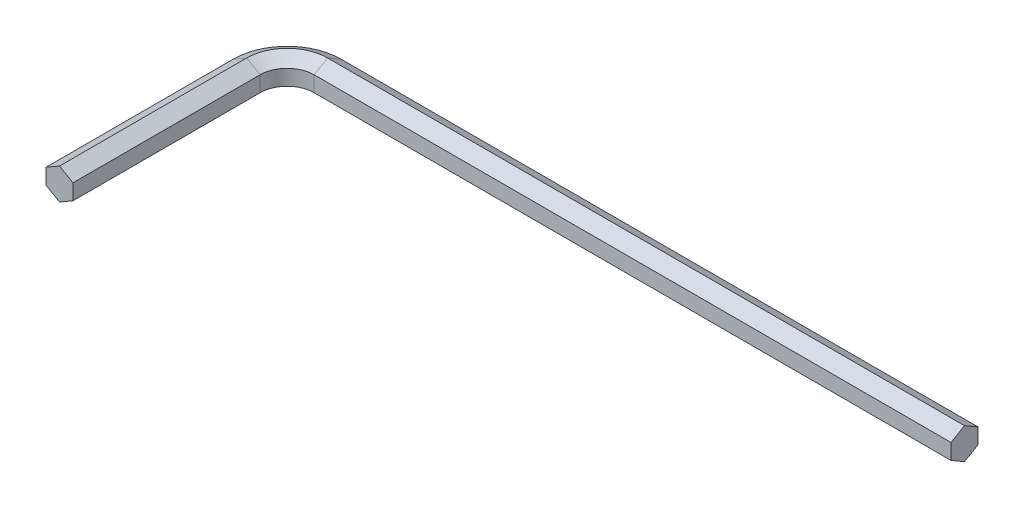
ISO-10303-21;
HEADER;
FILE_DESCRIPTION(('STEP AP214'),'2;1');
FILE_NAME('part.step','',(''),(''),'','','');
FILE_SCHEMA(('AUTOMOTIVE_DESIGN { 1 0 10303 214 1 1 1 1 }'));
ENDSEC;
DATA;
#1=APPLICATION_CONTEXT('core data for automotive mechanical design processes');
#2=APPLICATION_PROTOCOL_DEFINITION('international standard','automotive_design',2000,#1);
#3=PRODUCT_CONTEXT('',#1,'mechanical');
#4=PRODUCT('Part','Part','',(#3));
#5=PRODUCT_RELATED_PRODUCT_CATEGORY('part','',(#4));
#6=PRODUCT_DEFINITION_FORMATION('','',#4);
#7=PRODUCT_DEFINITION_CONTEXT('part definition',#1,'design');
#8=PRODUCT_DEFINITION('design','',#6,#7);
#9=PRODUCT_DEFINITION_SHAPE('','',#8);
#10=(LENGTH_UNIT() NAMED_UNIT(*) SI_UNIT(.MILLI.,.METRE.));
#11=(NAMED_UNIT(*) PLANE_ANGLE_UNIT() SI_UNIT($,.RADIAN.));
#12=(NAMED_UNIT(*) SI_UNIT($,.STERADIAN.) SOLID_ANGLE_UNIT());
#13=UNCERTAINTY_MEASURE_WITH_UNIT(LENGTH_MEASURE(1.E-05),#10,'distance_accuracy_value','');
#14=(GEOMETRIC_REPRESENTATION_CONTEXT(3) GLOBAL_UNCERTAINTY_ASSIGNED_CONTEXT((#13)) GLOBAL_UNIT_ASSIGNED_CONTEXT((#10,
#11,#12)) REPRESENTATION_CONTEXT('',''));
#15=CARTESIAN_POINT('',(0.,0.,0.));
#16=DIRECTION('',(0.,0.,1.));
#17=DIRECTION('',(1.,0.,0.));
#18=AXIS2_PLACEMENT_3D('',#15,#16,#17);
#19=CARTESIAN_POINT('',(-49.2125,1.15470053837925,2.00000000000002));
#20=DIRECTION('',(-1.,0.,0.));
#21=DIRECTION('',(0.,-1.,0.));
#22=AXIS2_PLACEMENT_3D('',#19,#20,#21);
#23=PLANE('',#22);
#24=DIRECTION('',(0.,-1.,0.));
#25=VECTOR('',#24,1.);
#26=CARTESIAN_POINT('',(-49.2125,1.15470053837925,2.00000000000002));
#27=LINE('',#26,#25);
#28=CARTESIAN_POINT('',(-49.2125,1.15470053837925,2.00000000000002));
#29=VERTEX_POINT('',#28);
#30=CARTESIAN_POINT('',(-49.2125,0.,2.00000000000002));
#31=VERTEX_POINT('',#30);
#32=EDGE_CURVE('E135',#29,#31,#27,.T.);
#33=ORIENTED_EDGE('',*,*,#32,.F.);
#34=DIRECTION('',(0.,0.,1.));
#35=VECTOR('',#34,1.);
#36=CARTESIAN_POINT('',(-49.2125,1.15470053837925,2.00000000000002));
#37=LINE('',#36,#35);
#38=CARTESIAN_POINT('',(-49.2125,1.15470053837925,15.875));
#39=VERTEX_POINT('',#38);
#40=EDGE_CURVE('E40',#29,#39,#37,.T.);
#41=ORIENTED_EDGE('',*,*,#40,.T.);
#42=DIRECTION('',(0.,-1.,0.));
#43=VECTOR('',#42,1.);
#44=CARTESIAN_POINT('',(-49.2125,1.15470053837925,15.875));
#45=LINE('',#44,#43);
#46=CARTESIAN_POINT('',(-49.2125,0.,15.875));
#47=VERTEX_POINT('',#46);
#48=EDGE_CURVE('E47',#39,#47,#45,.T.);
#49=ORIENTED_EDGE('',*,*,#48,.T.);
#50=DIRECTION('',(0.,0.,1.));
#51=VECTOR('',#50,1.);
#52=CARTESIAN_POINT('',(-49.2125,0.,2.00000000000002));
#53=LINE('',#52,#51);
#54=EDGE_CURVE('E11',#31,#47,#53,.T.);
#55=ORIENTED_EDGE('',*,*,#54,.F.);
#56=EDGE_LOOP('',(#33,#41,#49,#55));
#57=FACE_BOUND('',#56,.T.);
#58=ADVANCED_FACE('F33',(#57),#23,.F.);
#59=CARTESIAN_POINT('',(-50.2125,1.73205080756888,2.00000000000004));
#60=DIRECTION('',(-0.5,-0.866025403784438,0.));
#61=DIRECTION('',(0.866025403784439,-0.5,0.));
#62=AXIS2_PLACEMENT_3D('',#59,#60,#61);
#63=PLANE('',#62);
#64=DIRECTION('',(0.866025403784439,-0.5,0.));
#65=VECTOR('',#64,1.);
#66=CARTESIAN_POINT('',(-50.2125,1.73205080756888,2.00000000000004));
#67=LINE('',#66,#65);
#68=CARTESIAN_POINT('',(-50.2125,1.73205080756888,2.00000000000004));
#69=VERTEX_POINT('',#68);
#70=EDGE_CURVE('E203',#69,#29,#67,.T.);
#71=ORIENTED_EDGE('',*,*,#70,.F.);
#72=DIRECTION('',(0.,0.,1.));
#73=VECTOR('',#72,1.);
#74=CARTESIAN_POINT('',(-50.2125,1.73205080756888,2.00000000000004));
#75=LINE('',#74,#73);
#76=CARTESIAN_POINT('',(-50.2125,1.73205080756888,15.875));
#77=VERTEX_POINT('',#76);
#78=EDGE_CURVE('E239',#69,#77,#75,.T.);
#79=ORIENTED_EDGE('',*,*,#78,.T.);
#80=DIRECTION('',(0.866025403784439,-0.5,0.));
#81=VECTOR('',#80,1.);
#82=CARTESIAN_POINT('',(-50.2125,1.73205080756888,15.875));
#83=LINE('',#82,#81);
#84=EDGE_CURVE('E55',#77,#39,#83,.T.);
#85=ORIENTED_EDGE('',*,*,#84,.T.);
#86=ORIENTED_EDGE('',*,*,#40,.F.);
#87=EDGE_LOOP('',(#71,#79,#85,#86));
#88=FACE_BOUND('',#87,.T.);
#89=ADVANCED_FACE('F242',(#88),#63,.F.);
#90=CARTESIAN_POINT('',(-51.2125,1.15470053837925,2.00000000000005));
#91=DIRECTION('',(0.5,-0.866025403784439,0.));
#92=DIRECTION('',(0.866025403784439,0.5,0.));
#93=AXIS2_PLACEMENT_3D('',#90,#91,#92);
#94=PLANE('',#93);
#95=DIRECTION('',(0.866025403784439,0.5,0.));
#96=VECTOR('',#95,1.);
#97=CARTESIAN_POINT('',(-51.2125,1.15470053837925,2.00000000000005));
#98=LINE('',#97,#96);
#99=CARTESIAN_POINT('',(-51.2125,1.15470053837925,2.00000000000005));
#100=VERTEX_POINT('',#99);
#101=EDGE_CURVE('E200',#100,#69,#98,.T.);
#102=ORIENTED_EDGE('',*,*,#101,.F.);
#103=DIRECTION('',(0.,0.,1.));
#104=VECTOR('',#103,1.);
#105=CARTESIAN_POINT('',(-51.2125,1.15470053837925,2.00000000000005));
#106=LINE('',#105,#104);
#107=CARTESIAN_POINT('',(-51.2125,1.15470053837925,15.875));
#108=VERTEX_POINT('',#107);
#109=EDGE_CURVE('E236',#100,#108,#106,.T.);
#110=ORIENTED_EDGE('',*,*,#109,.T.);
#111=DIRECTION('',(0.866025403784439,0.5,0.));
#112=VECTOR('',#111,1.);
#113=CARTESIAN_POINT('',(-51.2125,1.15470053837925,15.875));
#114=LINE('',#113,#112);
#115=EDGE_CURVE('E226',#108,#77,#114,.T.);
#116=ORIENTED_EDGE('',*,*,#115,.T.);
#117=ORIENTED_EDGE('',*,*,#78,.F.);
#118=EDGE_LOOP('',(#102,#110,#116,#117));
#119=FACE_BOUND('',#118,.T.);
#120=ADVANCED_FACE('F277',(#119),#94,.F.);
#121=CARTESIAN_POINT('',(-51.2125,0.,2.00000000000005));
#122=DIRECTION('',(1.,0.,0.));
#123=DIRECTION('',(0.,1.,0.));
#124=AXIS2_PLACEMENT_3D('',#121,#122,#123);
#125=PLANE('',#124);
#126=DIRECTION('',(0.,1.,0.));
#127=VECTOR('',#126,1.);
#128=CARTESIAN_POINT('',(-51.2125,0.,2.00000000000005));
#129=LINE('',#128,#127);
#130=CARTESIAN_POINT('',(-51.2125,0.,2.00000000000005));
#131=VERTEX_POINT('',#130);
#132=EDGE_CURVE('E197',#131,#100,#129,.T.);
#133=ORIENTED_EDGE('',*,*,#132,.F.);
#134=DIRECTION('',(0.,0.,1.));
#135=VECTOR('',#134,1.);
#136=CARTESIAN_POINT('',(-51.2125,0.,2.00000000000005));
#137=LINE('',#136,#135);
#138=CARTESIAN_POINT('',(-51.2125,0.,15.875));
#139=VERTEX_POINT('',#138);
#140=EDGE_CURVE('E233',#131,#139,#137,.T.);
#141=ORIENTED_EDGE('',*,*,#140,.T.);
#142=DIRECTION('',(0.,1.,0.));
#143=VECTOR('',#142,1.);
#144=CARTESIAN_POINT('',(-51.2125,0.,15.875));
#145=LINE('',#144,#143);
#146=EDGE_CURVE('E224',#139,#108,#145,.T.);
#147=ORIENTED_EDGE('',*,*,#146,.T.);
#148=ORIENTED_EDGE('',*,*,#109,.F.);
#149=EDGE_LOOP('',(#133,#141,#147,#148));
#150=FACE_BOUND('',#149,.T.);
#151=ADVANCED_FACE('F268',(#150),#125,.F.);
#152=CARTESIAN_POINT('',(-50.2125,-0.577350269189626,2.00000000000004));
#153=DIRECTION('',(0.5,0.866025403784438,0.));
#154=DIRECTION('',(-0.866025403784439,0.5,0.));
#155=AXIS2_PLACEMENT_3D('',#152,#153,#154);
#156=PLANE('',#155);
#157=DIRECTION('',(-0.866025403784438,0.5,0.));
#158=VECTOR('',#157,1.);
#159=CARTESIAN_POINT('',(-50.2125,-0.577350269189626,2.00000000000004));
#160=LINE('',#159,#158);
#161=CARTESIAN_POINT('',(-50.2125,-0.577350269189626,2.00000000000004));
#162=VERTEX_POINT('',#161);
#163=EDGE_CURVE('E195',#162,#131,#160,.T.);
#164=ORIENTED_EDGE('',*,*,#163,.F.);
#165=DIRECTION('',(0.,0.,1.));
#166=VECTOR('',#165,1.);
#167=CARTESIAN_POINT('',(-50.2125,-0.577350269189626,2.00000000000004));
#168=LINE('',#167,#166);
#169=CARTESIAN_POINT('',(-50.2125,-0.577350269189626,15.875));
#170=VERTEX_POINT('',#169);
#171=EDGE_CURVE('E230',#162,#170,#168,.T.);
#172=ORIENTED_EDGE('',*,*,#171,.T.);
#173=DIRECTION('',(-0.866025403784438,0.5,0.));
#174=VECTOR('',#173,1.);
#175=CARTESIAN_POINT('',(-50.2125,-0.577350269189626,15.875));
#176=LINE('',#175,#174);
#177=EDGE_CURVE('E222',#170,#139,#176,.T.);
#178=ORIENTED_EDGE('',*,*,#177,.T.);
#179=ORIENTED_EDGE('',*,*,#140,.F.);
#180=EDGE_LOOP('',(#164,#172,#178,#179));
#181=FACE_BOUND('',#180,.T.);
#182=ADVANCED_FACE('F271',(#181),#156,.F.);
#183=CARTESIAN_POINT('',(-49.2125,0.,2.00000000000002));
#184=DIRECTION('',(-0.5,0.866025403784439,0.));
#185=DIRECTION('',(-0.866025403784439,-0.5,0.));
#186=AXIS2_PLACEMENT_3D('',#183,#184,#185);
#187=PLANE('',#186);
#188=DIRECTION('',(-0.866025403784438,-0.5,0.));
#189=VECTOR('',#188,1.);
#190=CARTESIAN_POINT('',(-49.2125,0.,2.00000000000002));
#191=LINE('',#190,#189);
#192=EDGE_CURVE('E131',#31,#162,#191,.T.);
#193=ORIENTED_EDGE('',*,*,#192,.F.);
#194=ORIENTED_EDGE('',*,*,#54,.T.);
#195=DIRECTION('',(-0.866025403784438,-0.5,0.));
#196=VECTOR('',#195,1.);
#197=CARTESIAN_POINT('',(-49.2125,0.,15.875));
#198=LINE('',#197,#196);
#199=EDGE_CURVE('E220',#47,#170,#198,.T.);
#200=ORIENTED_EDGE('',*,*,#199,.T.);
#201=ORIENTED_EDGE('',*,*,#171,.F.);
#202=EDGE_LOOP('',(#193,#194,#200,#201));
#203=FACE_BOUND('',#202,.T.);
#204=ADVANCED_FACE('F311',(#203),#187,.F.);
#205=CARTESIAN_POINT('',(-47.2125,0.,2.00000000000001));
#206=DIRECTION('',(0.,1.,0.));
#207=DIRECTION('',(0.,0.,1.));
#208=AXIS2_PLACEMENT_3D('',#205,#206,#207);
#209=CYLINDRICAL_SURFACE('',#208,2.);
#210=DIRECTION('',(0.,-1.,0.));
#211=VECTOR('',#210,1.);
#212=CARTESIAN_POINT('',(-47.2125,1.15470053837925,0.));
#213=LINE('',#212,#211);
#214=CARTESIAN_POINT('',(-47.2125,1.15470053837925,0.));
#215=VERTEX_POINT('',#214);
#216=CARTESIAN_POINT('',(-47.2125,0.,0.));
#217=VERTEX_POINT('',#216);
#218=EDGE_CURVE('E155',#215,#217,#213,.T.);
#219=ORIENTED_EDGE('',*,*,#218,.F.);
#220=CARTESIAN_POINT('',(-47.2125,1.15470053837925,2.00000000000001));
#221=DIRECTION('',(0.,1.,0.));
#222=DIRECTION('',(0.,0.,1.));
#223=AXIS2_PLACEMENT_3D('',#220,#221,#222);
#224=CIRCLE('',#223,2.);
#225=EDGE_CURVE('E215',#215,#29,#224,.T.);
#226=ORIENTED_EDGE('',*,*,#225,.T.);
#227=ORIENTED_EDGE('',*,*,#32,.T.);
#228=CARTESIAN_POINT('',(-47.2125,0.,2.00000000000001));
#229=DIRECTION('',(0.,1.,0.));
#230=DIRECTION('',(0.,0.,1.));
#231=AXIS2_PLACEMENT_3D('',#228,#229,#230);
#232=CIRCLE('',#231,2.);
#233=EDGE_CURVE('E218',#217,#31,#232,.T.);
#234=ORIENTED_EDGE('',*,*,#233,.F.);
#235=EDGE_LOOP('',(#219,#226,#227,#234));
#236=FACE_BOUND('',#235,.T.);
#237=ADVANCED_FACE('F320',(#236),#209,.F.);
#238=CARTESIAN_POINT('',(-47.2125,1.73205080756888,2.00000000000001));
#239=DIRECTION('',(0.,1.,0.));
#240=DIRECTION('',(0.,0.,1.));
#241=AXIS2_PLACEMENT_3D('',#238,#239,#240);
#242=CONICAL_SURFACE('',#241,3.,1.0471975511966);
#243=DIRECTION('',(0.,-0.5,0.866025403784439));
#244=VECTOR('',#243,1.);
#245=CARTESIAN_POINT('',(-47.2125,1.73205080756888,-0.999999999999995));
#246=LINE('',#245,#244);
#247=CARTESIAN_POINT('',(-47.2125,1.73205080756888,-0.999999999999995));
#248=VERTEX_POINT('',#247);
#249=EDGE_CURVE('E171',#248,#215,#246,.T.);
#250=ORIENTED_EDGE('',*,*,#249,.F.);
#251=CARTESIAN_POINT('',(-47.2125,1.73205080756888,2.00000000000001));
#252=DIRECTION('',(0.,1.,0.));
#253=DIRECTION('',(0.,0.,1.));
#254=AXIS2_PLACEMENT_3D('',#251,#252,#253);
#255=CIRCLE('',#254,3.);
#256=EDGE_CURVE('E212',#248,#69,#255,.T.);
#257=ORIENTED_EDGE('',*,*,#256,.T.);
#258=ORIENTED_EDGE('',*,*,#70,.T.);
#259=ORIENTED_EDGE('',*,*,#225,.F.);
#260=EDGE_LOOP('',(#250,#257,#258,#259));
#261=FACE_BOUND('',#260,.T.);
#262=ADVANCED_FACE('F250',(#261),#242,.F.);
#263=CARTESIAN_POINT('',(-47.2125,1.15470053837925,2.00000000000001));
#264=DIRECTION('',(0.,-1.,0.));
#265=DIRECTION('',(0.,0.,-1.));
#266=AXIS2_PLACEMENT_3D('',#263,#264,#265);
#267=CONICAL_SURFACE('',#266,4.,1.0471975511966);
#268=DIRECTION('',(0.,0.5,0.866025403784439));
#269=VECTOR('',#268,1.);
#270=CARTESIAN_POINT('',(-47.2125,1.15470053837925,-1.99999999999999));
#271=LINE('',#270,#269);
#272=CARTESIAN_POINT('',(-47.2125,1.15470053837925,-1.99999999999999));
#273=VERTEX_POINT('',#272);
#274=EDGE_CURVE('E168',#273,#248,#271,.T.);
#275=ORIENTED_EDGE('',*,*,#274,.F.);
#276=CARTESIAN_POINT('',(-47.2125,1.15470053837925,2.00000000000001));
#277=DIRECTION('',(0.,1.,0.));
#278=DIRECTION('',(0.,0.,1.));
#279=AXIS2_PLACEMENT_3D('',#276,#277,#278);
#280=CIRCLE('',#279,4.);
#281=EDGE_CURVE('E209',#273,#100,#280,.T.);
#282=ORIENTED_EDGE('',*,*,#281,.T.);
#283=ORIENTED_EDGE('',*,*,#101,.T.);
#284=ORIENTED_EDGE('',*,*,#256,.F.);
#285=EDGE_LOOP('',(#275,#282,#283,#284));
#286=FACE_BOUND('',#285,.T.);
#287=ADVANCED_FACE('F247',(#286),#267,.T.);
#288=CARTESIAN_POINT('',(-47.2125,0.,2.00000000000001));
#289=DIRECTION('',(0.,1.,0.));
#290=DIRECTION('',(0.,0.,1.));
#291=AXIS2_PLACEMENT_3D('',#288,#289,#290);
#292=CYLINDRICAL_SURFACE('',#291,4.);
#293=DIRECTION('',(0.,1.,0.));
#294=VECTOR('',#293,1.);
#295=CARTESIAN_POINT('',(-47.2125,0.,-1.99999999999999));
#296=LINE('',#295,#294);
#297=CARTESIAN_POINT('',(-47.2125,0.,-1.99999999999999));
#298=VERTEX_POINT('',#297);
#299=EDGE_CURVE('E144',#298,#273,#296,.T.);
#300=ORIENTED_EDGE('',*,*,#299,.F.);
#301=CARTESIAN_POINT('',(-47.2125,0.,2.00000000000001));
#302=DIRECTION('',(0.,1.,0.));
#303=DIRECTION('',(0.,0.,1.));
#304=AXIS2_PLACEMENT_3D('',#301,#302,#303);
#305=CIRCLE('',#304,4.);
#306=EDGE_CURVE('E134',#298,#131,#305,.T.);
#307=ORIENTED_EDGE('',*,*,#306,.T.);
#308=ORIENTED_EDGE('',*,*,#132,.T.);
#309=ORIENTED_EDGE('',*,*,#281,.F.);
#310=EDGE_LOOP('',(#300,#307,#308,#309));
#311=FACE_BOUND('',#310,.T.);
#312=ADVANCED_FACE('F265',(#311),#292,.T.);
#313=CARTESIAN_POINT('',(-47.2125,-0.577350269189626,2.00000000000001));
#314=DIRECTION('',(0.,1.,0.));
#315=DIRECTION('',(0.,0.,1.));
#316=AXIS2_PLACEMENT_3D('',#313,#314,#315);
#317=CONICAL_SURFACE('',#316,3.,1.0471975511966);
#318=DIRECTION('',(0.,0.5,-0.866025403784438));
#319=VECTOR('',#318,1.);
#320=CARTESIAN_POINT('',(-47.2125,-0.577350269189626,-0.999999999999995));
#321=LINE('',#320,#319);
#322=CARTESIAN_POINT('',(-47.2125,-0.577350269189626,-0.999999999999995));
#323=VERTEX_POINT('',#322);
#324=EDGE_CURVE('E138',#323,#298,#321,.T.);
#325=ORIENTED_EDGE('',*,*,#324,.F.);
#326=CARTESIAN_POINT('',(-47.2125,-0.577350269189626,2.00000000000001));
#327=DIRECTION('',(0.,1.,0.));
#328=DIRECTION('',(0.,0.,1.));
#329=AXIS2_PLACEMENT_3D('',#326,#327,#328);
#330=CIRCLE('',#329,3.);
#331=EDGE_CURVE('E123',#323,#162,#330,.T.);
#332=ORIENTED_EDGE('',*,*,#331,.T.);
#333=ORIENTED_EDGE('',*,*,#163,.T.);
#334=ORIENTED_EDGE('',*,*,#306,.F.);
#335=EDGE_LOOP('',(#325,#332,#333,#334));
#336=FACE_BOUND('',#335,.T.);
#337=ADVANCED_FACE('F140',(#336),#317,.T.);
#338=CARTESIAN_POINT('',(-47.2125,0.,2.00000000000001));
#339=DIRECTION('',(0.,-1.,0.));
#340=DIRECTION('',(0.,0.,-1.));
#341=AXIS2_PLACEMENT_3D('',#338,#339,#340);
#342=CONICAL_SURFACE('',#341,2.,1.0471975511966);
#343=DIRECTION('',(0.,-0.5,-0.866025403784438));
#344=VECTOR('',#343,1.);
#345=CARTESIAN_POINT('',(-47.2125,0.,0.));
#346=LINE('',#345,#344);
#347=EDGE_CURVE('E128',#217,#323,#346,.T.);
#348=ORIENTED_EDGE('',*,*,#347,.F.);
#349=ORIENTED_EDGE('',*,*,#233,.T.);
#350=ORIENTED_EDGE('',*,*,#192,.T.);
#351=ORIENTED_EDGE('',*,*,#331,.F.);
#352=EDGE_LOOP('',(#348,#349,#350,#351));
#353=FACE_BOUND('',#352,.T.);
#354=ADVANCED_FACE('F125',(#353),#342,.F.);
#355=CARTESIAN_POINT('',(-47.2125,0.,0.));
#356=DIRECTION('',(0.,-0.866025403784439,0.5));
#357=DIRECTION('',(0.,-0.5,-0.866025403784439));
#358=AXIS2_PLACEMENT_3D('',#355,#356,#357);
#359=PLANE('',#358);
#360=DIRECTION('',(0.,-0.5,-0.866025403784438));
#361=VECTOR('',#360,1.);
#362=CARTESIAN_POINT('',(0.,0.,0.));
#363=LINE('',#362,#361);
#364=CARTESIAN_POINT('',(0.,0.,0.));
#365=VERTEX_POINT('',#364);
#366=CARTESIAN_POINT('',(0.,-0.577350269189626,-1.));
#367=VERTEX_POINT('',#366);
#368=EDGE_CURVE('E175',#365,#367,#363,.T.);
#369=ORIENTED_EDGE('',*,*,#368,.F.);
#370=DIRECTION('',(1.,0.,0.));
#371=VECTOR('',#370,1.);
#372=CARTESIAN_POINT('',(-47.2125,0.,0.));
#373=LINE('',#372,#371);
#374=EDGE_CURVE('E158',#217,#365,#373,.T.);
#375=ORIENTED_EDGE('',*,*,#374,.F.);
#376=ORIENTED_EDGE('',*,*,#347,.T.);
#377=DIRECTION('',(1.,0.,0.));
#378=VECTOR('',#377,1.);
#379=CARTESIAN_POINT('',(-47.2125,-0.577350269189626,-0.999999999999995));
#380=LINE('',#379,#378);
#381=EDGE_CURVE('E147',#323,#367,#380,.T.);
#382=ORIENTED_EDGE('',*,*,#381,.T.);
#383=EDGE_LOOP('',(#369,#375,#376,#382));
#384=FACE_BOUND('',#383,.T.);
#385=ADVANCED_FACE('F157',(#384),#359,.T.);
#386=CARTESIAN_POINT('',(-47.2125,1.15470053837925,0.));
#387=DIRECTION('',(0.,0.,1.));
#388=DIRECTION('',(1.,0.,0.));
#389=AXIS2_PLACEMENT_3D('',#386,#387,#388);
#390=PLANE('',#389);
#391=DIRECTION('',(0.,-1.,0.));
#392=VECTOR('',#391,1.);
#393=CARTESIAN_POINT('',(0.,1.15470053837925,0.));
#394=LINE('',#393,#392);
#395=CARTESIAN_POINT('',(0.,1.15470053837925,0.));
#396=VERTEX_POINT('',#395);
#397=EDGE_CURVE('E160',#396,#365,#394,.T.);
#398=ORIENTED_EDGE('',*,*,#397,.F.);
#399=DIRECTION('',(1.,0.,0.));
#400=VECTOR('',#399,1.);
#401=CARTESIAN_POINT('',(-47.2125,1.15470053837925,0.));
#402=LINE('',#401,#400);
#403=EDGE_CURVE('E187',#215,#396,#402,.T.);
#404=ORIENTED_EDGE('',*,*,#403,.F.);
#405=ORIENTED_EDGE('',*,*,#218,.T.);
#406=ORIENTED_EDGE('',*,*,#374,.T.);
#407=EDGE_LOOP('',(#398,#404,#405,#406));
#408=FACE_BOUND('',#407,.T.);
#409=ADVANCED_FACE('F379',(#408),#390,.T.);
#410=CARTESIAN_POINT('',(-47.2125,1.73205080756888,-0.999999999999995));
#411=DIRECTION('',(0.,0.866025403784438,0.5));
#412=DIRECTION('',(0.,-0.5,0.866025403784439));
#413=AXIS2_PLACEMENT_3D('',#410,#411,#412);
#414=PLANE('',#413);
#415=DIRECTION('',(0.,-0.5,0.866025403784439));
#416=VECTOR('',#415,1.);
#417=CARTESIAN_POINT('',(0.,1.73205080756888,-1.));
#418=LINE('',#417,#416);
#419=CARTESIAN_POINT('',(0.,1.73205080756888,-1.));
#420=VERTEX_POINT('',#419);
#421=EDGE_CURVE('E163',#420,#396,#418,.T.);
#422=ORIENTED_EDGE('',*,*,#421,.F.);
#423=DIRECTION('',(1.,0.,0.));
#424=VECTOR('',#423,1.);
#425=CARTESIAN_POINT('',(-47.2125,1.73205080756888,-0.999999999999995));
#426=LINE('',#425,#424);
#427=EDGE_CURVE('E189',#248,#420,#426,.T.);
#428=ORIENTED_EDGE('',*,*,#427,.F.);
#429=ORIENTED_EDGE('',*,*,#249,.T.);
#430=ORIENTED_EDGE('',*,*,#403,.T.);
#431=EDGE_LOOP('',(#422,#428,#429,#430));
#432=FACE_BOUND('',#431,.T.);
#433=ADVANCED_FACE('F255',(#432),#414,.T.);
#434=CARTESIAN_POINT('',(-47.2125,1.15470053837925,-1.99999999999999));
#435=DIRECTION('',(0.,0.866025403784439,-0.5));
#436=DIRECTION('',(0.,0.5,0.866025403784439));
#437=AXIS2_PLACEMENT_3D('',#434,#435,#436);
#438=PLANE('',#437);
#439=DIRECTION('',(0.,0.5,0.866025403784439));
#440=VECTOR('',#439,1.);
#441=CARTESIAN_POINT('',(0.,1.15470053837925,-2.));
#442=LINE('',#441,#440);
#443=CARTESIAN_POINT('',(0.,1.15470053837925,-2.));
#444=VERTEX_POINT('',#443);
#445=EDGE_CURVE('E181',#444,#420,#442,.T.);
#446=ORIENTED_EDGE('',*,*,#445,.F.);
#447=DIRECTION('',(1.,0.,0.));
#448=VECTOR('',#447,1.);
#449=CARTESIAN_POINT('',(-47.2125,1.15470053837925,-1.99999999999999));
#450=LINE('',#449,#448);
#451=EDGE_CURVE('E191',#273,#444,#450,.T.);
#452=ORIENTED_EDGE('',*,*,#451,.F.);
#453=ORIENTED_EDGE('',*,*,#274,.T.);
#454=ORIENTED_EDGE('',*,*,#427,.T.);
#455=EDGE_LOOP('',(#446,#452,#453,#454));
#456=FACE_BOUND('',#455,.T.);
#457=ADVANCED_FACE('F259',(#456),#438,.T.);
#458=CARTESIAN_POINT('',(-47.2125,0.,-1.99999999999999));
#459=DIRECTION('',(0.,0.,-1.));
#460=DIRECTION('',(0.,1.,0.));
#461=AXIS2_PLACEMENT_3D('',#458,#459,#460);
#462=PLANE('',#461);
#463=DIRECTION('',(0.,1.,0.));
#464=VECTOR('',#463,1.);
#465=CARTESIAN_POINT('',(0.,0.,-2.));
#466=LINE('',#465,#464);
#467=CARTESIAN_POINT('',(0.,0.,-2.));
#468=VERTEX_POINT('',#467);
#469=EDGE_CURVE('E178',#468,#444,#466,.T.);
#470=ORIENTED_EDGE('',*,*,#469,.F.);
#471=DIRECTION('',(1.,0.,0.));
#472=VECTOR('',#471,1.);
#473=CARTESIAN_POINT('',(-47.2125,0.,-1.99999999999999));
#474=LINE('',#473,#472);
#475=EDGE_CURVE('E154',#298,#468,#474,.T.);
#476=ORIENTED_EDGE('',*,*,#475,.F.);
#477=ORIENTED_EDGE('',*,*,#299,.T.);
#478=ORIENTED_EDGE('',*,*,#451,.T.);
#479=EDGE_LOOP('',(#470,#476,#477,#478));
#480=FACE_BOUND('',#479,.T.);
#481=ADVANCED_FACE('F263',(#480),#462,.T.);
#482=CARTESIAN_POINT('',(-47.2125,-0.577350269189626,-0.999999999999995));
#483=DIRECTION('',(0.,-0.866025403784438,-0.5));
#484=DIRECTION('',(0.,0.5,-0.866025403784439));
#485=AXIS2_PLACEMENT_3D('',#482,#483,#484);
#486=PLANE('',#485);
#487=DIRECTION('',(0.,0.5,-0.866025403784438));
#488=VECTOR('',#487,1.);
#489=CARTESIAN_POINT('',(0.,-0.577350269189626,-1.));
#490=LINE('',#489,#488);
#491=EDGE_CURVE('E150',#367,#468,#490,.T.);
#492=ORIENTED_EDGE('',*,*,#491,.F.);
#493=ORIENTED_EDGE('',*,*,#381,.F.);
#494=ORIENTED_EDGE('',*,*,#324,.T.);
#495=ORIENTED_EDGE('',*,*,#475,.T.);
#496=EDGE_LOOP('',(#492,#493,#494,#495));
#497=FACE_BOUND('',#496,.T.);
#498=ADVANCED_FACE('F148',(#497),#486,.T.);
#499=CARTESIAN_POINT('',(-49.2125,0.,15.875));
#500=DIRECTION('',(0.,0.,-1.));
#501=DIRECTION('',(-1.,0.,0.));
#502=AXIS2_PLACEMENT_3D('',#499,#500,#501);
#503=PLANE('',#502);
#504=ORIENTED_EDGE('',*,*,#199,.F.);
#505=ORIENTED_EDGE('',*,*,#48,.F.);
#506=ORIENTED_EDGE('',*,*,#84,.F.);
#507=ORIENTED_EDGE('',*,*,#115,.F.);
#508=ORIENTED_EDGE('',*,*,#146,.F.);
#509=ORIENTED_EDGE('',*,*,#177,.F.);
#510=EDGE_LOOP('',(#504,#505,#506,#507,#508,#509));
#511=FACE_BOUND('',#510,.T.);
#512=ADVANCED_FACE('F276',(#511),#503,.F.);
#513=CARTESIAN_POINT('',(0.,0.,0.));
#514=DIRECTION('',(1.,0.,0.));
#515=DIRECTION('',(0.,0.,-1.));
#516=AXIS2_PLACEMENT_3D('',#513,#514,#515);
#517=PLANE('',#516);
#518=ORIENTED_EDGE('',*,*,#368,.T.);
#519=ORIENTED_EDGE('',*,*,#491,.T.);
#520=ORIENTED_EDGE('',*,*,#469,.T.);
#521=ORIENTED_EDGE('',*,*,#445,.T.);
#522=ORIENTED_EDGE('',*,*,#421,.T.);
#523=ORIENTED_EDGE('',*,*,#397,.T.);
#524=EDGE_LOOP('',(#518,#519,#520,#521,#522,#523));
#525=FACE_BOUND('',#524,.T.);
#526=ADVANCED_FACE('F429',(#525),#517,.T.);
#527=CLOSED_SHELL('',(#58,#89,#120,#151,#182,#204,#237,#262,#287,#312,#337,#354,#385,#409,#433,
#457,#481,#498,#512,#526));
#528=MANIFOLD_SOLID_BREP('B2',#527);
#529=ADVANCED_BREP_SHAPE_REPRESENTATION('',(#18,#528),#14);
#530=SHAPE_DEFINITION_REPRESENTATION(#9,#529);
ENDSEC;
END-ISO-10303-21;
